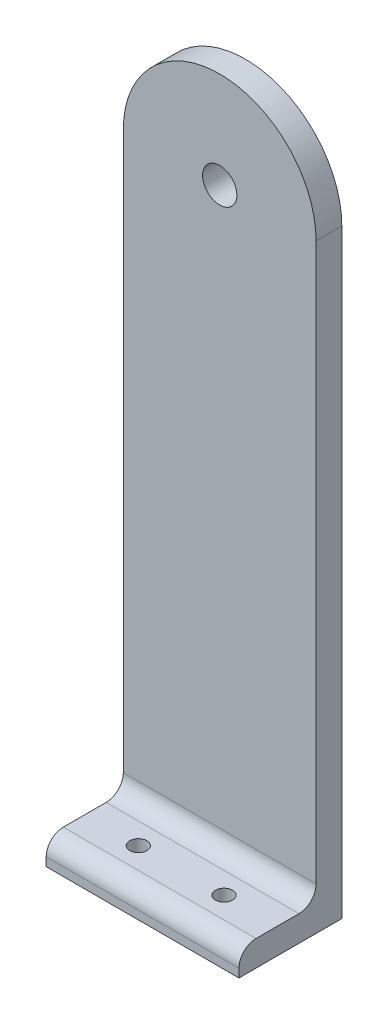
ISO-10303-21;
HEADER;
FILE_DESCRIPTION(('STEP AP214'),'2;1');
FILE_NAME('part.step','',(''),(''),'','','');
FILE_SCHEMA(('AUTOMOTIVE_DESIGN { 1 0 10303 214 1 1 1 1 }'));
ENDSEC;
DATA;
#1=APPLICATION_CONTEXT('core data for automotive mechanical design processes');
#2=APPLICATION_PROTOCOL_DEFINITION('international standard','automotive_design',2000,#1);
#3=PRODUCT_CONTEXT('',#1,'mechanical');
#4=PRODUCT('Part','Part','',(#3));
#5=PRODUCT_RELATED_PRODUCT_CATEGORY('part','',(#4));
#6=PRODUCT_DEFINITION_FORMATION('','',#4);
#7=PRODUCT_DEFINITION_CONTEXT('part definition',#1,'design');
#8=PRODUCT_DEFINITION('design','',#6,#7);
#9=PRODUCT_DEFINITION_SHAPE('','',#8);
#10=(LENGTH_UNIT() NAMED_UNIT(*) SI_UNIT(.MILLI.,.METRE.));
#11=(NAMED_UNIT(*) PLANE_ANGLE_UNIT() SI_UNIT($,.RADIAN.));
#12=(NAMED_UNIT(*) SI_UNIT($,.STERADIAN.) SOLID_ANGLE_UNIT());
#13=UNCERTAINTY_MEASURE_WITH_UNIT(LENGTH_MEASURE(1.E-05),#10,'distance_accuracy_value','');
#14=(GEOMETRIC_REPRESENTATION_CONTEXT(3) GLOBAL_UNCERTAINTY_ASSIGNED_CONTEXT((#13)) GLOBAL_UNIT_ASSIGNED_CONTEXT((#10,
#11,#12)) REPRESENTATION_CONTEXT('',''));
#15=CARTESIAN_POINT('',(0.,0.,0.));
#16=DIRECTION('',(0.,0.,1.));
#17=DIRECTION('',(1.,0.,0.));
#18=AXIS2_PLACEMENT_3D('',#15,#16,#17);
#19=CARTESIAN_POINT('',(0.,0.,7.62));
#20=DIRECTION('',(0.,0.,-1.));
#21=DIRECTION('',(-1.,0.,0.));
#22=AXIS2_PLACEMENT_3D('',#19,#20,#21);
#23=CYLINDRICAL_SURFACE('',#22,28.575);
#24=CARTESIAN_POINT('',(0.,0.,0.));
#25=DIRECTION('',(0.,0.,1.));
#26=DIRECTION('',(-1.,0.,0.));
#27=AXIS2_PLACEMENT_3D('',#24,#25,#26);
#28=CIRCLE('',#27,28.575);
#29=CARTESIAN_POINT('',(28.575,0.,0.));
#30=VERTEX_POINT('',#29);
#31=CARTESIAN_POINT('',(-28.575,0.,0.));
#32=VERTEX_POINT('',#31);
#33=EDGE_CURVE('E145',#30,#32,#28,.T.);
#34=ORIENTED_EDGE('',*,*,#33,.T.);
#35=DIRECTION('',(0.,0.,-1.));
#36=VECTOR('',#35,1.);
#37=CARTESIAN_POINT('',(-28.575,0.,7.62));
#38=LINE('',#37,#36);
#39=CARTESIAN_POINT('',(-28.575,0.,7.62));
#40=VERTEX_POINT('',#39);
#41=EDGE_CURVE('E165',#40,#32,#38,.T.);
#42=ORIENTED_EDGE('',*,*,#41,.F.);
#43=CARTESIAN_POINT('',(0.,0.,7.62));
#44=DIRECTION('',(0.,0.,1.));
#45=DIRECTION('',(-1.,0.,0.));
#46=AXIS2_PLACEMENT_3D('',#43,#44,#45);
#47=CIRCLE('',#46,28.575);
#48=CARTESIAN_POINT('',(28.575,0.,7.62));
#49=VERTEX_POINT('',#48);
#50=EDGE_CURVE('E147',#49,#40,#47,.T.);
#51=ORIENTED_EDGE('',*,*,#50,.F.);
#52=DIRECTION('',(0.,0.,-1.));
#53=VECTOR('',#52,1.);
#54=CARTESIAN_POINT('',(28.575,0.,7.62));
#55=LINE('',#54,#53);
#56=EDGE_CURVE('E114',#49,#30,#55,.T.);
#57=ORIENTED_EDGE('',*,*,#56,.T.);
#58=EDGE_LOOP('',(#34,#42,#51,#57));
#59=FACE_BOUND('',#58,.T.);
#60=ADVANCED_FACE('F38',(#59),#23,.T.);
#61=CARTESIAN_POINT('',(-28.575,0.,7.62));
#62=DIRECTION('',(1.,0.,0.));
#63=DIRECTION('',(0.,1.,0.));
#64=AXIS2_PLACEMENT_3D('',#61,#62,#63);
#65=PLANE('',#64);
#66=DIRECTION('',(0.,-1.,0.));
#67=VECTOR('',#66,1.);
#68=CARTESIAN_POINT('',(-28.575,0.,0.));
#69=LINE('',#68,#67);
#70=CARTESIAN_POINT('',(-28.575,-177.8,0.));
#71=VERTEX_POINT('',#70);
#72=EDGE_CURVE('E158',#32,#71,#69,.T.);
#73=ORIENTED_EDGE('',*,*,#72,.T.);
#74=DIRECTION('',(0.,0.,-1.));
#75=VECTOR('',#74,1.);
#76=CARTESIAN_POINT('',(-28.575,-177.8,7.62));
#77=LINE('',#76,#75);
#78=CARTESIAN_POINT('',(-28.575,-177.8,30.48));
#79=VERTEX_POINT('',#78);
#80=EDGE_CURVE('E113',#79,#71,#77,.T.);
#81=ORIENTED_EDGE('',*,*,#80,.F.);
#82=DIRECTION('',(0.,1.,0.));
#83=VECTOR('',#82,1.);
#84=CARTESIAN_POINT('',(-28.575,-177.8,30.48));
#85=LINE('',#84,#83);
#86=CARTESIAN_POINT('',(-28.575,-175.26,30.48));
#87=VERTEX_POINT('',#86);
#88=EDGE_CURVE('E121',#79,#87,#85,.T.);
#89=ORIENTED_EDGE('',*,*,#88,.T.);
#90=CARTESIAN_POINT('',(-28.575,-175.26,25.4));
#91=DIRECTION('',(-1.,0.,0.));
#92=DIRECTION('',(0.,1.,0.));
#93=AXIS2_PLACEMENT_3D('',#90,#91,#92);
#94=CIRCLE('',#93,5.08);
#95=CARTESIAN_POINT('',(-28.575,-170.18,25.4));
#96=VERTEX_POINT('',#95);
#97=EDGE_CURVE('E132',#87,#96,#94,.T.);
#98=ORIENTED_EDGE('',*,*,#97,.T.);
#99=DIRECTION('',(0.,0.,-1.));
#100=VECTOR('',#99,1.);
#101=CARTESIAN_POINT('',(-28.575,-170.18,0.));
#102=LINE('',#101,#100);
#103=CARTESIAN_POINT('',(-28.575,-170.18,12.7));
#104=VERTEX_POINT('',#103);
#105=EDGE_CURVE('E129',#96,#104,#102,.T.);
#106=ORIENTED_EDGE('',*,*,#105,.T.);
#107=CARTESIAN_POINT('',(-28.575,-165.1,12.7));
#108=DIRECTION('',(1.,0.,0.));
#109=DIRECTION('',(0.,1.,0.));
#110=AXIS2_PLACEMENT_3D('',#107,#108,#109);
#111=CIRCLE('',#110,5.08);
#112=CARTESIAN_POINT('',(-28.575,-165.1,7.62));
#113=VERTEX_POINT('',#112);
#114=EDGE_CURVE('E11',#104,#113,#111,.T.);
#115=ORIENTED_EDGE('',*,*,#114,.T.);
#116=DIRECTION('',(0.,-1.,0.));
#117=VECTOR('',#116,1.);
#118=CARTESIAN_POINT('',(-28.575,0.,7.62));
#119=LINE('',#118,#117);
#120=EDGE_CURVE('E150',#40,#113,#119,.T.);
#121=ORIENTED_EDGE('',*,*,#120,.F.);
#122=ORIENTED_EDGE('',*,*,#41,.T.);
#123=EDGE_LOOP('',(#73,#81,#89,#98,#106,#115,#121,#122));
#124=FACE_BOUND('',#123,.T.);
#125=ADVANCED_FACE('F182',(#124),#65,.F.);
#126=CARTESIAN_POINT('',(-28.575,-177.8,7.62));
#127=DIRECTION('',(0.,1.,0.));
#128=DIRECTION('',(0.,0.,1.));
#129=AXIS2_PLACEMENT_3D('',#126,#127,#128);
#130=PLANE('',#129);
#131=CARTESIAN_POINT('',(12.7,-177.8,19.05));
#132=DIRECTION('',(0.,1.,0.));
#133=DIRECTION('',(-1.,0.,0.));
#134=AXIS2_PLACEMENT_3D('',#131,#132,#133);
#135=CIRCLE('',#134,2.54);
#136=CARTESIAN_POINT('',(10.16,-177.8,19.05));
#137=VERTEX_POINT('',#136);
#138=EDGE_CURVE('E140',#137,#137,#135,.T.);
#139=ORIENTED_EDGE('',*,*,#138,.T.);
#140=EDGE_LOOP('',(#139));
#141=FACE_BOUND('',#140,.T.);
#142=CARTESIAN_POINT('',(-12.7,-177.8,19.05));
#143=DIRECTION('',(0.,1.,0.));
#144=DIRECTION('',(-1.,0.,0.));
#145=AXIS2_PLACEMENT_3D('',#142,#143,#144);
#146=CIRCLE('',#145,2.54);
#147=CARTESIAN_POINT('',(-15.24,-177.8,19.05));
#148=VERTEX_POINT('',#147);
#149=EDGE_CURVE('E236',#148,#148,#146,.T.);
#150=ORIENTED_EDGE('',*,*,#149,.T.);
#151=EDGE_LOOP('',(#150));
#152=FACE_BOUND('',#151,.T.);
#153=DIRECTION('',(1.,0.,0.));
#154=VECTOR('',#153,1.);
#155=CARTESIAN_POINT('',(-28.575,-177.8,0.));
#156=LINE('',#155,#154);
#157=CARTESIAN_POINT('',(28.575,-177.8,0.));
#158=VERTEX_POINT('',#157);
#159=EDGE_CURVE('E110',#71,#158,#156,.T.);
#160=ORIENTED_EDGE('',*,*,#159,.T.);
#161=DIRECTION('',(0.,0.,-1.));
#162=VECTOR('',#161,1.);
#163=CARTESIAN_POINT('',(28.575,-177.8,7.62));
#164=LINE('',#163,#162);
#165=CARTESIAN_POINT('',(28.575,-177.8,30.48));
#166=VERTEX_POINT('',#165);
#167=EDGE_CURVE('E103',#166,#158,#164,.T.);
#168=ORIENTED_EDGE('',*,*,#167,.F.);
#169=DIRECTION('',(-1.,0.,0.));
#170=VECTOR('',#169,1.);
#171=CARTESIAN_POINT('',(28.575,-177.8,30.48));
#172=LINE('',#171,#170);
#173=EDGE_CURVE('E107',#166,#79,#172,.T.);
#174=ORIENTED_EDGE('',*,*,#173,.T.);
#175=ORIENTED_EDGE('',*,*,#80,.T.);
#176=EDGE_LOOP('',(#160,#168,#174,#175));
#177=FACE_BOUND('',#176,.T.);
#178=ADVANCED_FACE('F105',(#141,#152,#177),#130,.F.);
#179=CARTESIAN_POINT('',(28.575,-177.8,7.62));
#180=DIRECTION('',(-1.,0.,0.));
#181=DIRECTION('',(0.,-1.,0.));
#182=AXIS2_PLACEMENT_3D('',#179,#180,#181);
#183=PLANE('',#182);
#184=DIRECTION('',(0.,1.,0.));
#185=VECTOR('',#184,1.);
#186=CARTESIAN_POINT('',(28.575,-177.8,7.62));
#187=LINE('',#186,#185);
#188=CARTESIAN_POINT('',(28.575,-165.1,7.62));
#189=VERTEX_POINT('',#188);
#190=EDGE_CURVE('E154',#189,#49,#187,.T.);
#191=ORIENTED_EDGE('',*,*,#190,.F.);
#192=CARTESIAN_POINT('',(28.575,-165.1,12.7));
#193=DIRECTION('',(-1.,0.,0.));
#194=DIRECTION('',(0.,-1.,0.));
#195=AXIS2_PLACEMENT_3D('',#192,#193,#194);
#196=CIRCLE('',#195,5.08);
#197=CARTESIAN_POINT('',(28.575,-170.18,12.7));
#198=VERTEX_POINT('',#197);
#199=EDGE_CURVE('E46',#189,#198,#196,.T.);
#200=ORIENTED_EDGE('',*,*,#199,.T.);
#201=DIRECTION('',(0.,0.,-1.));
#202=VECTOR('',#201,1.);
#203=CARTESIAN_POINT('',(28.575,-170.18,0.));
#204=LINE('',#203,#202);
#205=CARTESIAN_POINT('',(28.575,-170.18,25.4));
#206=VERTEX_POINT('',#205);
#207=EDGE_CURVE('E123',#206,#198,#204,.T.);
#208=ORIENTED_EDGE('',*,*,#207,.F.);
#209=CARTESIAN_POINT('',(28.575,-175.26,25.4));
#210=DIRECTION('',(-1.,0.,0.));
#211=DIRECTION('',(0.,1.,0.));
#212=AXIS2_PLACEMENT_3D('',#209,#210,#211);
#213=CIRCLE('',#212,5.08);
#214=CARTESIAN_POINT('',(28.575,-175.26,30.48));
#215=VERTEX_POINT('',#214);
#216=EDGE_CURVE('E128',#215,#206,#213,.T.);
#217=ORIENTED_EDGE('',*,*,#216,.F.);
#218=DIRECTION('',(0.,1.,0.));
#219=VECTOR('',#218,1.);
#220=CARTESIAN_POINT('',(28.575,-177.8,30.48));
#221=LINE('',#220,#219);
#222=EDGE_CURVE('E119',#166,#215,#221,.T.);
#223=ORIENTED_EDGE('',*,*,#222,.F.);
#224=ORIENTED_EDGE('',*,*,#167,.T.);
#225=DIRECTION('',(0.,1.,0.));
#226=VECTOR('',#225,1.);
#227=CARTESIAN_POINT('',(28.575,-177.8,0.));
#228=LINE('',#227,#226);
#229=EDGE_CURVE('E151',#158,#30,#228,.T.);
#230=ORIENTED_EDGE('',*,*,#229,.T.);
#231=ORIENTED_EDGE('',*,*,#56,.F.);
#232=EDGE_LOOP('',(#191,#200,#208,#217,#223,#224,#230,#231));
#233=FACE_BOUND('',#232,.T.);
#234=ADVANCED_FACE('F126',(#233),#183,.F.);
#235=CARTESIAN_POINT('',(0.,0.,7.62));
#236=DIRECTION('',(0.,0.,-1.));
#237=DIRECTION('',(-1.,0.,0.));
#238=AXIS2_PLACEMENT_3D('',#235,#236,#237);
#239=PLANE('',#238);
#240=CARTESIAN_POINT('',(0.,0.,7.62));
#241=DIRECTION('',(0.,0.,-1.));
#242=DIRECTION('',(-1.,0.,0.));
#243=AXIS2_PLACEMENT_3D('',#240,#241,#242);
#244=CIRCLE('',#243,5.08);
#245=CARTESIAN_POINT('',(-5.08,0.,7.62));
#246=VERTEX_POINT('',#245);
#247=EDGE_CURVE('E233',#246,#246,#244,.T.);
#248=ORIENTED_EDGE('',*,*,#247,.T.);
#249=EDGE_LOOP('',(#248));
#250=FACE_BOUND('',#249,.T.);
#251=ORIENTED_EDGE('',*,*,#120,.T.);
#252=DIRECTION('',(1.,0.,0.));
#253=VECTOR('',#252,1.);
#254=CARTESIAN_POINT('',(0.,-165.1,7.62));
#255=LINE('',#254,#253);
#256=EDGE_CURVE('E168',#113,#189,#255,.T.);
#257=ORIENTED_EDGE('',*,*,#256,.T.);
#258=ORIENTED_EDGE('',*,*,#190,.T.);
#259=ORIENTED_EDGE('',*,*,#50,.T.);
#260=EDGE_LOOP('',(#251,#257,#258,#259));
#261=FACE_BOUND('',#260,.T.);
#262=ADVANCED_FACE('F173',(#250,#261),#239,.F.);
#263=CARTESIAN_POINT('',(0.,0.,0.));
#264=DIRECTION('',(0.,0.,-1.));
#265=DIRECTION('',(-1.,0.,0.));
#266=AXIS2_PLACEMENT_3D('',#263,#264,#265);
#267=PLANE('',#266);
#268=CARTESIAN_POINT('',(0.,0.,0.));
#269=DIRECTION('',(0.,0.,-1.));
#270=DIRECTION('',(-1.,0.,0.));
#271=AXIS2_PLACEMENT_3D('',#268,#269,#270);
#272=CIRCLE('',#271,5.08);
#273=CARTESIAN_POINT('',(-5.08,0.,0.));
#274=VERTEX_POINT('',#273);
#275=EDGE_CURVE('E230',#274,#274,#272,.T.);
#276=ORIENTED_EDGE('',*,*,#275,.F.);
#277=EDGE_LOOP('',(#276));
#278=FACE_BOUND('',#277,.T.);
#279=ORIENTED_EDGE('',*,*,#33,.F.);
#280=ORIENTED_EDGE('',*,*,#229,.F.);
#281=ORIENTED_EDGE('',*,*,#159,.F.);
#282=ORIENTED_EDGE('',*,*,#72,.F.);
#283=EDGE_LOOP('',(#279,#280,#281,#282));
#284=FACE_BOUND('',#283,.T.);
#285=ADVANCED_FACE('F205',(#278,#284),#267,.T.);
#286=CARTESIAN_POINT('',(28.575,-170.18,0.));
#287=DIRECTION('',(0.,1.,0.));
#288=DIRECTION('',(-1.,0.,0.));
#289=AXIS2_PLACEMENT_3D('',#286,#287,#288);
#290=PLANE('',#289);
#291=CARTESIAN_POINT('',(12.7,-170.18,19.05));
#292=DIRECTION('',(0.,1.,0.));
#293=DIRECTION('',(-1.,0.,0.));
#294=AXIS2_PLACEMENT_3D('',#291,#292,#293);
#295=CIRCLE('',#294,2.54);
#296=CARTESIAN_POINT('',(10.16,-170.18,19.05));
#297=VERTEX_POINT('',#296);
#298=EDGE_CURVE('E241',#297,#297,#295,.T.);
#299=ORIENTED_EDGE('',*,*,#298,.F.);
#300=EDGE_LOOP('',(#299));
#301=FACE_BOUND('',#300,.T.);
#302=CARTESIAN_POINT('',(-12.7,-170.18,19.05));
#303=DIRECTION('',(0.,1.,0.));
#304=DIRECTION('',(-1.,0.,0.));
#305=AXIS2_PLACEMENT_3D('',#302,#303,#304);
#306=CIRCLE('',#305,2.54);
#307=CARTESIAN_POINT('',(-15.24,-170.18,19.05));
#308=VERTEX_POINT('',#307);
#309=EDGE_CURVE('E135',#308,#308,#306,.T.);
#310=ORIENTED_EDGE('',*,*,#309,.F.);
#311=EDGE_LOOP('',(#310));
#312=FACE_BOUND('',#311,.T.);
#313=ORIENTED_EDGE('',*,*,#207,.T.);
#314=DIRECTION('',(1.,0.,0.));
#315=VECTOR('',#314,1.);
#316=CARTESIAN_POINT('',(28.575,-170.18,12.7));
#317=LINE('',#316,#315);
#318=EDGE_CURVE('E59',#198,#104,#317,.F.);
#319=ORIENTED_EDGE('',*,*,#318,.T.);
#320=ORIENTED_EDGE('',*,*,#105,.F.);
#321=DIRECTION('',(-1.,0.,0.));
#322=VECTOR('',#321,1.);
#323=CARTESIAN_POINT('',(28.575,-170.18,25.4));
#324=LINE('',#323,#322);
#325=EDGE_CURVE('E143',#206,#96,#324,.T.);
#326=ORIENTED_EDGE('',*,*,#325,.F.);
#327=EDGE_LOOP('',(#313,#319,#320,#326));
#328=FACE_BOUND('',#327,.T.);
#329=ADVANCED_FACE('F208',(#301,#312,#328),#290,.T.);
#330=CARTESIAN_POINT('',(28.575,-175.26,25.4));
#331=DIRECTION('',(-1.,0.,0.));
#332=DIRECTION('',(0.,-1.,0.));
#333=AXIS2_PLACEMENT_3D('',#330,#331,#332);
#334=CYLINDRICAL_SURFACE('',#333,5.08);
#335=ORIENTED_EDGE('',*,*,#97,.F.);
#336=DIRECTION('',(-1.,0.,0.));
#337=VECTOR('',#336,1.);
#338=CARTESIAN_POINT('',(28.575,-175.26,30.48));
#339=LINE('',#338,#337);
#340=EDGE_CURVE('E122',#215,#87,#339,.T.);
#341=ORIENTED_EDGE('',*,*,#340,.F.);
#342=ORIENTED_EDGE('',*,*,#216,.T.);
#343=ORIENTED_EDGE('',*,*,#325,.T.);
#344=EDGE_LOOP('',(#335,#341,#342,#343));
#345=FACE_BOUND('',#344,.T.);
#346=ADVANCED_FACE('F192',(#345),#334,.T.);
#347=CARTESIAN_POINT('',(28.575,-177.8,30.48));
#348=DIRECTION('',(0.,0.,1.));
#349=DIRECTION('',(1.,0.,0.));
#350=AXIS2_PLACEMENT_3D('',#347,#348,#349);
#351=PLANE('',#350);
#352=ORIENTED_EDGE('',*,*,#88,.F.);
#353=ORIENTED_EDGE('',*,*,#173,.F.);
#354=ORIENTED_EDGE('',*,*,#222,.T.);
#355=ORIENTED_EDGE('',*,*,#340,.T.);
#356=EDGE_LOOP('',(#352,#353,#354,#355));
#357=FACE_BOUND('',#356,.T.);
#358=ADVANCED_FACE('F118',(#357),#351,.T.);
#359=CARTESIAN_POINT('',(0.,-165.1,12.7));
#360=DIRECTION('',(1.,0.,0.));
#361=DIRECTION('',(0.,1.,0.));
#362=AXIS2_PLACEMENT_3D('',#359,#360,#361);
#363=CYLINDRICAL_SURFACE('',#362,5.08);
#364=ORIENTED_EDGE('',*,*,#114,.F.);
#365=ORIENTED_EDGE('',*,*,#318,.F.);
#366=ORIENTED_EDGE('',*,*,#199,.F.);
#367=ORIENTED_EDGE('',*,*,#256,.F.);
#368=EDGE_LOOP('',(#364,#365,#366,#367));
#369=FACE_BOUND('',#368,.T.);
#370=ADVANCED_FACE('F40',(#369),#363,.F.);
#371=CARTESIAN_POINT('',(-12.7,-177.8,19.05));
#372=DIRECTION('',(0.,1.,0.));
#373=DIRECTION('',(-1.,0.,0.));
#374=AXIS2_PLACEMENT_3D('',#371,#372,#373);
#375=CYLINDRICAL_SURFACE('',#374,2.54);
#376=ORIENTED_EDGE('',*,*,#149,.F.);
#377=EDGE_LOOP('',(#376));
#378=FACE_BOUND('',#377,.T.);
#379=ORIENTED_EDGE('',*,*,#309,.T.);
#380=EDGE_LOOP('',(#379));
#381=FACE_BOUND('',#380,.T.);
#382=ADVANCED_FACE('F184',(#378,#381),#375,.F.);
#383=CARTESIAN_POINT('',(12.7,-177.8,19.05));
#384=DIRECTION('',(0.,1.,0.));
#385=DIRECTION('',(-1.,0.,0.));
#386=AXIS2_PLACEMENT_3D('',#383,#384,#385);
#387=CYLINDRICAL_SURFACE('',#386,2.54);
#388=ORIENTED_EDGE('',*,*,#138,.F.);
#389=EDGE_LOOP('',(#388));
#390=FACE_BOUND('',#389,.T.);
#391=ORIENTED_EDGE('',*,*,#298,.T.);
#392=EDGE_LOOP('',(#391));
#393=FACE_BOUND('',#392,.T.);
#394=ADVANCED_FACE('F189',(#390,#393),#387,.F.);
#395=CARTESIAN_POINT('',(0.,0.,30.48));
#396=DIRECTION('',(0.,0.,-1.));
#397=DIRECTION('',(-1.,0.,0.));
#398=AXIS2_PLACEMENT_3D('',#395,#396,#397);
#399=CYLINDRICAL_SURFACE('',#398,5.08);
#400=ORIENTED_EDGE('',*,*,#275,.T.);
#401=EDGE_LOOP('',(#400));
#402=FACE_BOUND('',#401,.T.);
#403=ORIENTED_EDGE('',*,*,#247,.F.);
#404=EDGE_LOOP('',(#403));
#405=FACE_BOUND('',#404,.T.);
#406=ADVANCED_FACE('F221',(#402,#405),#399,.F.);
#407=CLOSED_SHELL('',(#60,#125,#178,#234,#262,#285,#329,#346,#358,#370,#382,#394,#406));
#408=MANIFOLD_SOLID_BREP('B2',#407);
#409=ADVANCED_BREP_SHAPE_REPRESENTATION('',(#18,#408),#14);
#410=SHAPE_DEFINITION_REPRESENTATION(#9,#409);
ENDSEC;
END-ISO-10303-21;
